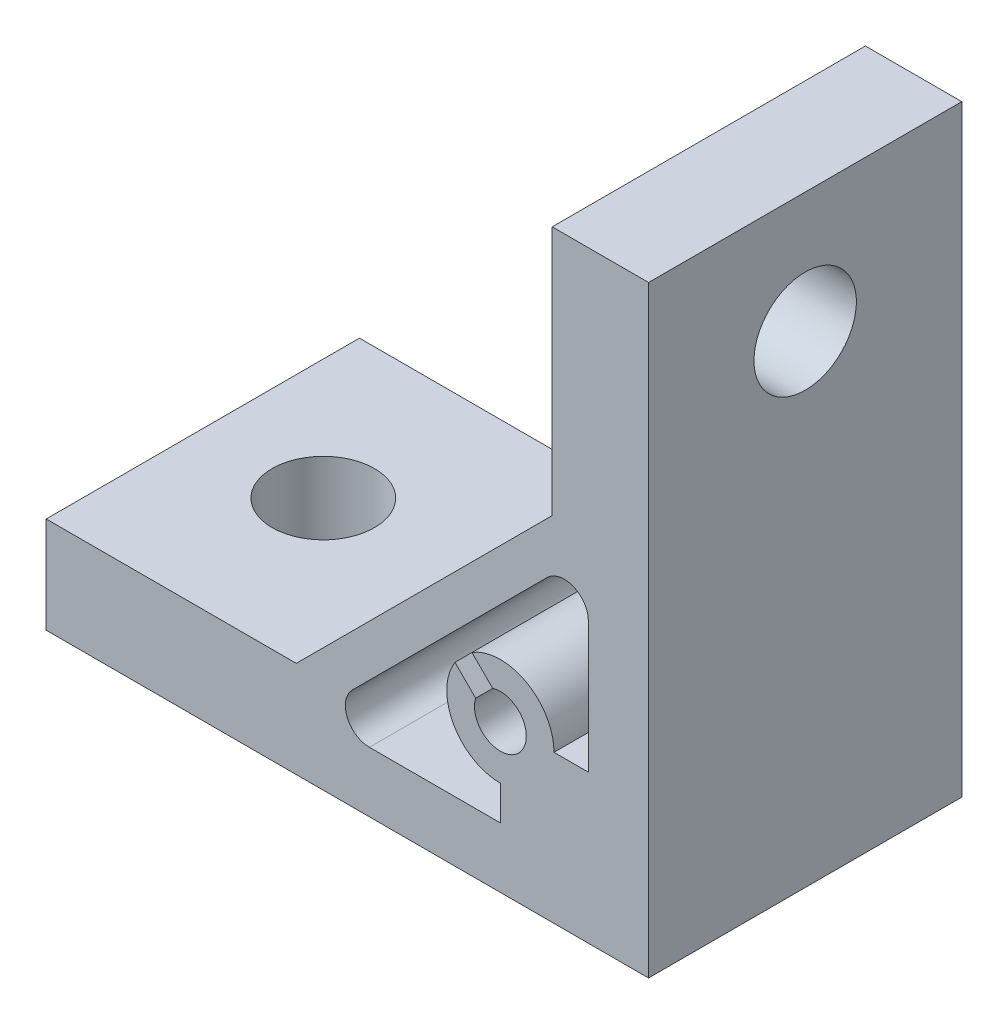
ISO-10303-21;
HEADER;
FILE_DESCRIPTION(('STEP AP214'),'2;1');
FILE_NAME('part.step','',(''),(''),'','','');
FILE_SCHEMA(('AUTOMOTIVE_DESIGN { 1 0 10303 214 1 1 1 1 }'));
ENDSEC;
DATA;
#1=APPLICATION_CONTEXT('core data for automotive mechanical design processes');
#2=APPLICATION_PROTOCOL_DEFINITION('international standard','automotive_design',2000,#1);
#3=PRODUCT_CONTEXT('',#1,'mechanical');
#4=PRODUCT('Part','Part','',(#3));
#5=PRODUCT_RELATED_PRODUCT_CATEGORY('part','',(#4));
#6=PRODUCT_DEFINITION_FORMATION('','',#4);
#7=PRODUCT_DEFINITION_CONTEXT('part definition',#1,'design');
#8=PRODUCT_DEFINITION('design','',#6,#7);
#9=PRODUCT_DEFINITION_SHAPE('','',#8);
#10=(LENGTH_UNIT() NAMED_UNIT(*) SI_UNIT(.MILLI.,.METRE.));
#11=(NAMED_UNIT(*) PLANE_ANGLE_UNIT() SI_UNIT($,.RADIAN.));
#12=(NAMED_UNIT(*) SI_UNIT($,.STERADIAN.) SOLID_ANGLE_UNIT());
#13=UNCERTAINTY_MEASURE_WITH_UNIT(LENGTH_MEASURE(1.E-05),#10,'distance_accuracy_value','');
#14=(GEOMETRIC_REPRESENTATION_CONTEXT(3) GLOBAL_UNCERTAINTY_ASSIGNED_CONTEXT((#13)) GLOBAL_UNIT_ASSIGNED_CONTEXT((#10,
#11,#12)) REPRESENTATION_CONTEXT('',''));
#15=CARTESIAN_POINT('',(0.,0.,0.));
#16=DIRECTION('',(0.,0.,1.));
#17=DIRECTION('',(1.,0.,0.));
#18=AXIS2_PLACEMENT_3D('',#15,#16,#17);
#19=CARTESIAN_POINT('',(50.,0.,13.));
#20=DIRECTION('',(-1.,0.,0.));
#21=DIRECTION('',(0.,0.,1.));
#22=AXIS2_PLACEMENT_3D('',#19,#20,#21);
#23=PLANE('',#22);
#24=DIRECTION('',(0.,1.,0.));
#25=VECTOR('',#24,1.);
#26=CARTESIAN_POINT('',(50.,0.,-13.));
#27=LINE('',#26,#25);
#28=CARTESIAN_POINT('',(50.,0.,-13.));
#29=VERTEX_POINT('',#28);
#30=CARTESIAN_POINT('',(50.,50.,-13.));
#31=VERTEX_POINT('',#30);
#32=EDGE_CURVE('E283',#29,#31,#27,.T.);
#33=ORIENTED_EDGE('',*,*,#32,.T.);
#34=DIRECTION('',(0.,0.,-1.));
#35=VECTOR('',#34,1.);
#36=CARTESIAN_POINT('',(50.,50.,13.));
#37=LINE('',#36,#35);
#38=CARTESIAN_POINT('',(50.,50.,13.));
#39=VERTEX_POINT('',#38);
#40=EDGE_CURVE('E303',#39,#31,#37,.T.);
#41=ORIENTED_EDGE('',*,*,#40,.F.);
#42=DIRECTION('',(0.,1.,0.));
#43=VECTOR('',#42,1.);
#44=CARTESIAN_POINT('',(50.,0.,13.));
#45=LINE('',#44,#43);
#46=CARTESIAN_POINT('',(50.,0.,13.));
#47=VERTEX_POINT('',#46);
#48=EDGE_CURVE('E268',#47,#39,#45,.T.);
#49=ORIENTED_EDGE('',*,*,#48,.F.);
#50=DIRECTION('',(0.,0.,-1.));
#51=VECTOR('',#50,1.);
#52=CARTESIAN_POINT('',(50.,0.,13.));
#53=LINE('',#52,#51);
#54=EDGE_CURVE('E43',#47,#29,#53,.T.);
#55=ORIENTED_EDGE('',*,*,#54,.T.);
#56=EDGE_LOOP('',(#33,#41,#49,#55));
#57=FACE_BOUND('',#56,.T.);
#58=CARTESIAN_POINT('',(50.0000000000001,40.,0.));
#59=DIRECTION('',(1.,0.,0.));
#60=DIRECTION('',(0.,0.,1.));
#61=AXIS2_PLACEMENT_3D('',#58,#59,#60);
#62=CIRCLE('',#61,4.25);
#63=CARTESIAN_POINT('',(50.0000000000001,40.,4.25));
#64=VERTEX_POINT('',#63);
#65=EDGE_CURVE('E369',#64,#64,#62,.T.);
#66=ORIENTED_EDGE('',*,*,#65,.F.);
#67=EDGE_LOOP('',(#66));
#68=FACE_BOUND('',#67,.T.);
#69=ADVANCED_FACE('F35',(#57,#68),#23,.F.);
#70=CARTESIAN_POINT('',(42.,29.2426406871192,13.));
#71=DIRECTION('',(1.,0.,0.));
#72=DIRECTION('',(0.,0.,-1.));
#73=AXIS2_PLACEMENT_3D('',#70,#71,#72);
#74=PLANE('',#73);
#75=DIRECTION('',(0.,-1.,0.));
#76=VECTOR('',#75,1.);
#77=CARTESIAN_POINT('',(42.,29.2426406871192,-13.));
#78=LINE('',#77,#76);
#79=CARTESIAN_POINT('',(42.,50.,-13.));
#80=VERTEX_POINT('',#79);
#81=CARTESIAN_POINT('',(42.,29.2426406871192,-13.));
#82=VERTEX_POINT('',#81);
#83=EDGE_CURVE('E287',#80,#82,#78,.T.);
#84=ORIENTED_EDGE('',*,*,#83,.T.);
#85=DIRECTION('',(0.,0.,-1.));
#86=VECTOR('',#85,1.);
#87=CARTESIAN_POINT('',(42.,29.2426406871192,13.));
#88=LINE('',#87,#86);
#89=CARTESIAN_POINT('',(42.,29.2426406871192,13.));
#90=VERTEX_POINT('',#89);
#91=EDGE_CURVE('E297',#90,#82,#88,.T.);
#92=ORIENTED_EDGE('',*,*,#91,.F.);
#93=DIRECTION('',(0.,-1.,0.));
#94=VECTOR('',#93,1.);
#95=CARTESIAN_POINT('',(42.,29.2426406871192,13.));
#96=LINE('',#95,#94);
#97=CARTESIAN_POINT('',(42.,50.,13.));
#98=VERTEX_POINT('',#97);
#99=EDGE_CURVE('E272',#98,#90,#96,.T.);
#100=ORIENTED_EDGE('',*,*,#99,.F.);
#101=DIRECTION('',(0.,0.,-1.));
#102=VECTOR('',#101,1.);
#103=CARTESIAN_POINT('',(42.,50.,13.));
#104=LINE('',#103,#102);
#105=EDGE_CURVE('E300',#98,#80,#104,.T.);
#106=ORIENTED_EDGE('',*,*,#105,.T.);
#107=EDGE_LOOP('',(#84,#92,#100,#106));
#108=FACE_BOUND('',#107,.T.);
#109=CARTESIAN_POINT('',(42.0000000000002,40.,0.));
#110=DIRECTION('',(1.,0.,0.));
#111=DIRECTION('',(0.,0.,1.));
#112=AXIS2_PLACEMENT_3D('',#109,#110,#111);
#113=CIRCLE('',#112,4.25);
#114=CARTESIAN_POINT('',(42.0000000000002,40.,4.25));
#115=VERTEX_POINT('',#114);
#116=EDGE_CURVE('E371',#115,#115,#113,.T.);
#117=ORIENTED_EDGE('',*,*,#116,.T.);
#118=EDGE_LOOP('',(#117));
#119=FACE_BOUND('',#118,.T.);
#120=ADVANCED_FACE('F326',(#108,#119),#74,.F.);
#121=CARTESIAN_POINT('',(0.,0.,13.));
#122=DIRECTION('',(0.,0.,1.));
#123=DIRECTION('',(1.,0.,0.));
#124=AXIS2_PLACEMENT_3D('',#121,#122,#123);
#125=PLANE('',#124);
#126=DIRECTION('',(0.,-1.,0.));
#127=VECTOR('',#126,1.);
#128=CARTESIAN_POINT('',(0.,8.,13.));
#129=LINE('',#128,#127);
#130=CARTESIAN_POINT('',(0.,8.,13.));
#131=VERTEX_POINT('',#130);
#132=CARTESIAN_POINT('',(0.,0.,13.));
#133=VERTEX_POINT('',#132);
#134=EDGE_CURVE('E262',#131,#133,#129,.T.);
#135=ORIENTED_EDGE('',*,*,#134,.T.);
#136=DIRECTION('',(1.,0.,0.));
#137=VECTOR('',#136,1.);
#138=CARTESIAN_POINT('',(0.,0.,13.));
#139=LINE('',#138,#137);
#140=EDGE_CURVE('E265',#133,#47,#139,.T.);
#141=ORIENTED_EDGE('',*,*,#140,.T.);
#142=ORIENTED_EDGE('',*,*,#48,.T.);
#143=DIRECTION('',(-1.,0.,0.));
#144=VECTOR('',#143,1.);
#145=CARTESIAN_POINT('',(42.,50.,13.));
#146=LINE('',#145,#144);
#147=EDGE_CURVE('E270',#39,#98,#146,.T.);
#148=ORIENTED_EDGE('',*,*,#147,.T.);
#149=ORIENTED_EDGE('',*,*,#99,.T.);
#150=DIRECTION('',(-0.707106781186546,-0.707106781186549,0.));
#151=VECTOR('',#150,1.);
#152=CARTESIAN_POINT('',(20.7573593128809,8.,13.));
#153=LINE('',#152,#151);
#154=CARTESIAN_POINT('',(20.7573593128809,8.,13.));
#155=VERTEX_POINT('',#154);
#156=EDGE_CURVE('E274',#90,#155,#153,.T.);
#157=ORIENTED_EDGE('',*,*,#156,.T.);
#158=DIRECTION('',(-1.,0.,0.));
#159=VECTOR('',#158,1.);
#160=CARTESIAN_POINT('',(0.,8.,13.));
#161=LINE('',#160,#159);
#162=EDGE_CURVE('E276',#155,#131,#161,.T.);
#163=ORIENTED_EDGE('',*,*,#162,.T.);
#164=EDGE_LOOP('',(#135,#141,#142,#148,#149,#157,#163));
#165=FACE_BOUND('',#164,.T.);
#166=DIRECTION('',(0.707106781186549,-0.707106781186546,0.));
#167=VECTOR('',#166,1.);
#168=CARTESIAN_POINT('',(35.647066335444,12.9387201021829,13.));
#169=LINE('',#168,#167);
#170=CARTESIAN_POINT('',(33.9267474297161,14.6590390079109,13.));
#171=VERTEX_POINT('',#170);
#172=CARTESIAN_POINT('',(35.647066335444,12.9387201021829,13.));
#173=VERTEX_POINT('',#172);
#174=EDGE_CURVE('E174',#171,#173,#169,.T.);
#175=ORIENTED_EDGE('',*,*,#174,.F.);
#176=CARTESIAN_POINT('',(37.7,12.3,13.));
#177=DIRECTION('',(0.,0.,-1.));
#178=DIRECTION('',(1.,0.,0.));
#179=AXIS2_PLACEMENT_3D('',#176,#177,#178);
#180=CIRCLE('',#179,4.45);
#181=CARTESIAN_POINT('',(37.7,7.84999999999995,13.));
#182=VERTEX_POINT('',#181);
#183=EDGE_CURVE('E166',#182,#171,#180,.T.);
#184=ORIENTED_EDGE('',*,*,#183,.F.);
#185=DIRECTION('',(0.,1.,0.));
#186=VECTOR('',#185,1.);
#187=CARTESIAN_POINT('',(37.7,5.,13.));
#188=LINE('',#187,#186);
#189=CARTESIAN_POINT('',(37.7,5.,13.));
#190=VERTEX_POINT('',#189);
#191=EDGE_CURVE('E209',#190,#182,#188,.T.);
#192=ORIENTED_EDGE('',*,*,#191,.F.);
#193=DIRECTION('',(1.,0.,0.));
#194=VECTOR('',#193,1.);
#195=CARTESIAN_POINT('',(26.828427124746,5.,13.));
#196=LINE('',#195,#194);
#197=CARTESIAN_POINT('',(26.828427124746,4.99999999999993,13.));
#198=VERTEX_POINT('',#197);
#199=EDGE_CURVE('E207',#198,#190,#196,.T.);
#200=ORIENTED_EDGE('',*,*,#199,.F.);
#201=CARTESIAN_POINT('',(26.8284271247464,7.00000000000011,13.));
#202=DIRECTION('',(0.,0.,1.));
#203=DIRECTION('',(1.,0.,0.));
#204=AXIS2_PLACEMENT_3D('',#201,#202,#203);
#205=CIRCLE('',#204,2.00000000000019);
#206=CARTESIAN_POINT('',(25.4142135623729,8.41421356237311,13.));
#207=VERTEX_POINT('',#206);
#208=EDGE_CURVE('E205',#207,#198,#205,.T.);
#209=ORIENTED_EDGE('',*,*,#208,.F.);
#210=DIRECTION('',(-0.70710678118655,-0.707106781186545,0.));
#211=VECTOR('',#210,1.);
#212=CARTESIAN_POINT('',(25.4142135623729,8.41421356237311,13.));
#213=LINE('',#212,#211);
#214=CARTESIAN_POINT('',(41.585786437627,24.5857864376269,13.));
#215=VERTEX_POINT('',#214);
#216=EDGE_CURVE('E203',#215,#207,#213,.T.);
#217=ORIENTED_EDGE('',*,*,#216,.F.);
#218=CARTESIAN_POINT('',(43.0000000000002,23.171572875254,13.));
#219=DIRECTION('',(0.,0.,1.));
#220=DIRECTION('',(1.,0.,0.));
#221=AXIS2_PLACEMENT_3D('',#218,#219,#220);
#222=CIRCLE('',#221,1.99999999999993);
#223=CARTESIAN_POINT('',(45.,23.1715728752539,13.));
#224=VERTEX_POINT('',#223);
#225=EDGE_CURVE('E201',#224,#215,#222,.T.);
#226=ORIENTED_EDGE('',*,*,#225,.F.);
#227=DIRECTION('',(0.,1.,0.));
#228=VECTOR('',#227,1.);
#229=CARTESIAN_POINT('',(45.,23.1715728752539,13.));
#230=LINE('',#229,#228);
#231=CARTESIAN_POINT('',(45.,12.3,13.));
#232=VERTEX_POINT('',#231);
#233=EDGE_CURVE('E199',#232,#224,#230,.T.);
#234=ORIENTED_EDGE('',*,*,#233,.F.);
#235=DIRECTION('',(1.,0.,0.));
#236=VECTOR('',#235,1.);
#237=CARTESIAN_POINT('',(42.15,12.3,13.));
#238=LINE('',#237,#236);
#239=CARTESIAN_POINT('',(42.15,12.3,13.));
#240=VERTEX_POINT('',#239);
#241=EDGE_CURVE('E197',#240,#232,#238,.T.);
#242=ORIENTED_EDGE('',*,*,#241,.F.);
#243=CARTESIAN_POINT('',(37.7,12.3,13.));
#244=DIRECTION('',(0.,0.,-1.));
#245=DIRECTION('',(1.,0.,0.));
#246=AXIS2_PLACEMENT_3D('',#243,#244,#245);
#247=CIRCLE('',#246,4.45);
#248=CARTESIAN_POINT('',(35.3409609920885,16.0732525702836,13.));
#249=VERTEX_POINT('',#248);
#250=EDGE_CURVE('E195',#249,#240,#247,.T.);
#251=ORIENTED_EDGE('',*,*,#250,.F.);
#252=DIRECTION('',(-0.707106781186684,0.707106781186411,0.));
#253=VECTOR('',#252,1.);
#254=CARTESIAN_POINT('',(37.0612798978168,14.3529336645559,13.));
#255=LINE('',#254,#253);
#256=CARTESIAN_POINT('',(37.0612798978168,14.3529336645559,13.));
#257=VERTEX_POINT('',#256);
#258=EDGE_CURVE('E190',#257,#249,#255,.T.);
#259=ORIENTED_EDGE('',*,*,#258,.F.);
#260=CARTESIAN_POINT('',(37.7,12.3,13.));
#261=DIRECTION('',(0.,0.,1.));
#262=DIRECTION('',(1.,0.,0.));
#263=AXIS2_PLACEMENT_3D('',#260,#261,#262);
#264=CIRCLE('',#263,2.15);
#265=EDGE_CURVE('E188',#173,#257,#264,.T.);
#266=ORIENTED_EDGE('',*,*,#265,.F.);
#267=EDGE_LOOP('',(#175,#184,#192,#200,#209,#217,#226,#234,#242,#251,#259,#266));
#268=FACE_BOUND('',#267,.T.);
#269=ADVANCED_FACE('F186',(#165,#268),#125,.T.);
#270=CARTESIAN_POINT('',(0.,0.,-13.));
#271=DIRECTION('',(0.,0.,1.));
#272=DIRECTION('',(1.,0.,0.));
#273=AXIS2_PLACEMENT_3D('',#270,#271,#272);
#274=PLANE('',#273);
#275=DIRECTION('',(0.,-1.,0.));
#276=VECTOR('',#275,1.);
#277=CARTESIAN_POINT('',(0.,8.,-13.));
#278=LINE('',#277,#276);
#279=CARTESIAN_POINT('',(0.,8.,-13.));
#280=VERTEX_POINT('',#279);
#281=CARTESIAN_POINT('',(0.,0.,-13.));
#282=VERTEX_POINT('',#281);
#283=EDGE_CURVE('E182',#280,#282,#278,.T.);
#284=ORIENTED_EDGE('',*,*,#283,.F.);
#285=DIRECTION('',(-1.,0.,0.));
#286=VECTOR('',#285,1.);
#287=CARTESIAN_POINT('',(0.,8.,-13.));
#288=LINE('',#287,#286);
#289=CARTESIAN_POINT('',(20.7573593128809,8.,-13.));
#290=VERTEX_POINT('',#289);
#291=EDGE_CURVE('E266',#290,#280,#288,.T.);
#292=ORIENTED_EDGE('',*,*,#291,.F.);
#293=DIRECTION('',(-0.707106781186546,-0.707106781186549,0.));
#294=VECTOR('',#293,1.);
#295=CARTESIAN_POINT('',(20.7573593128809,8.,-13.));
#296=LINE('',#295,#294);
#297=EDGE_CURVE('E289',#82,#290,#296,.T.);
#298=ORIENTED_EDGE('',*,*,#297,.F.);
#299=ORIENTED_EDGE('',*,*,#83,.F.);
#300=DIRECTION('',(-1.,0.,0.));
#301=VECTOR('',#300,1.);
#302=CARTESIAN_POINT('',(42.,50.,-13.));
#303=LINE('',#302,#301);
#304=EDGE_CURVE('E285',#31,#80,#303,.T.);
#305=ORIENTED_EDGE('',*,*,#304,.F.);
#306=ORIENTED_EDGE('',*,*,#32,.F.);
#307=DIRECTION('',(1.,0.,0.));
#308=VECTOR('',#307,1.);
#309=CARTESIAN_POINT('',(0.,0.,-13.));
#310=LINE('',#309,#308);
#311=EDGE_CURVE('E281',#282,#29,#310,.T.);
#312=ORIENTED_EDGE('',*,*,#311,.F.);
#313=EDGE_LOOP('',(#284,#292,#298,#299,#305,#306,#312));
#314=FACE_BOUND('',#313,.T.);
#315=CARTESIAN_POINT('',(37.7,12.3,-13.));
#316=DIRECTION('',(0.,0.,-1.));
#317=DIRECTION('',(1.,0.,0.));
#318=AXIS2_PLACEMENT_3D('',#315,#316,#317);
#319=CIRCLE('',#318,4.45);
#320=CARTESIAN_POINT('',(37.7,7.84999999999995,-13.));
#321=VERTEX_POINT('',#320);
#322=CARTESIAN_POINT('',(33.9267474297161,14.6590390079109,-13.));
#323=VERTEX_POINT('',#322);
#324=EDGE_CURVE('E58',#321,#323,#319,.T.);
#325=ORIENTED_EDGE('',*,*,#324,.T.);
#326=DIRECTION('',(0.707106781186549,-0.707106781186546,0.));
#327=VECTOR('',#326,1.);
#328=CARTESIAN_POINT('',(35.647066335444,12.9387201021829,-13.));
#329=LINE('',#328,#327);
#330=CARTESIAN_POINT('',(35.647066335444,12.9387201021829,-13.));
#331=VERTEX_POINT('',#330);
#332=EDGE_CURVE('E181',#323,#331,#329,.T.);
#333=ORIENTED_EDGE('',*,*,#332,.T.);
#334=CARTESIAN_POINT('',(37.7,12.3,-13.));
#335=DIRECTION('',(0.,0.,1.));
#336=DIRECTION('',(1.,0.,0.));
#337=AXIS2_PLACEMENT_3D('',#334,#335,#336);
#338=CIRCLE('',#337,2.15);
#339=CARTESIAN_POINT('',(37.0612798978168,14.3529336645559,-13.));
#340=VERTEX_POINT('',#339);
#341=EDGE_CURVE('E214',#331,#340,#338,.T.);
#342=ORIENTED_EDGE('',*,*,#341,.T.);
#343=DIRECTION('',(-0.707106781186684,0.707106781186411,0.));
#344=VECTOR('',#343,1.);
#345=CARTESIAN_POINT('',(37.0612798978168,14.3529336645559,-13.));
#346=LINE('',#345,#344);
#347=CARTESIAN_POINT('',(35.3409609920885,16.0732525702836,-13.));
#348=VERTEX_POINT('',#347);
#349=EDGE_CURVE('E217',#340,#348,#346,.T.);
#350=ORIENTED_EDGE('',*,*,#349,.T.);
#351=CARTESIAN_POINT('',(37.7,12.3,-13.));
#352=DIRECTION('',(0.,0.,-1.));
#353=DIRECTION('',(1.,0.,0.));
#354=AXIS2_PLACEMENT_3D('',#351,#352,#353);
#355=CIRCLE('',#354,4.45);
#356=CARTESIAN_POINT('',(42.15,12.3,-13.));
#357=VERTEX_POINT('',#356);
#358=EDGE_CURVE('E220',#348,#357,#355,.T.);
#359=ORIENTED_EDGE('',*,*,#358,.T.);
#360=DIRECTION('',(1.,0.,0.));
#361=VECTOR('',#360,1.);
#362=CARTESIAN_POINT('',(42.15,12.3,-13.));
#363=LINE('',#362,#361);
#364=CARTESIAN_POINT('',(45.,12.3,-13.));
#365=VERTEX_POINT('',#364);
#366=EDGE_CURVE('E223',#357,#365,#363,.T.);
#367=ORIENTED_EDGE('',*,*,#366,.T.);
#368=DIRECTION('',(0.,1.,0.));
#369=VECTOR('',#368,1.);
#370=CARTESIAN_POINT('',(45.,23.1715728752539,-13.));
#371=LINE('',#370,#369);
#372=CARTESIAN_POINT('',(45.,23.1715728752539,-13.));
#373=VERTEX_POINT('',#372);
#374=EDGE_CURVE('E226',#365,#373,#371,.T.);
#375=ORIENTED_EDGE('',*,*,#374,.T.);
#376=CARTESIAN_POINT('',(43.0000000000002,23.171572875254,-13.));
#377=DIRECTION('',(0.,0.,1.));
#378=DIRECTION('',(1.,0.,0.));
#379=AXIS2_PLACEMENT_3D('',#376,#377,#378);
#380=CIRCLE('',#379,1.99999999999993);
#381=CARTESIAN_POINT('',(41.585786437627,24.5857864376269,-13.));
#382=VERTEX_POINT('',#381);
#383=EDGE_CURVE('E229',#373,#382,#380,.T.);
#384=ORIENTED_EDGE('',*,*,#383,.T.);
#385=DIRECTION('',(-0.70710678118655,-0.707106781186545,0.));
#386=VECTOR('',#385,1.);
#387=CARTESIAN_POINT('',(25.4142135623729,8.41421356237311,-13.));
#388=LINE('',#387,#386);
#389=CARTESIAN_POINT('',(25.4142135623729,8.41421356237311,-13.));
#390=VERTEX_POINT('',#389);
#391=EDGE_CURVE('E232',#382,#390,#388,.T.);
#392=ORIENTED_EDGE('',*,*,#391,.T.);
#393=CARTESIAN_POINT('',(26.8284271247464,7.00000000000011,-13.));
#394=DIRECTION('',(0.,0.,1.));
#395=DIRECTION('',(1.,0.,0.));
#396=AXIS2_PLACEMENT_3D('',#393,#394,#395);
#397=CIRCLE('',#396,2.00000000000019);
#398=CARTESIAN_POINT('',(26.828427124746,4.99999999999993,-13.));
#399=VERTEX_POINT('',#398);
#400=EDGE_CURVE('E235',#390,#399,#397,.T.);
#401=ORIENTED_EDGE('',*,*,#400,.T.);
#402=DIRECTION('',(1.,0.,0.));
#403=VECTOR('',#402,1.);
#404=CARTESIAN_POINT('',(26.828427124746,5.,-13.));
#405=LINE('',#404,#403);
#406=CARTESIAN_POINT('',(37.7,5.,-13.));
#407=VERTEX_POINT('',#406);
#408=EDGE_CURVE('E238',#399,#407,#405,.T.);
#409=ORIENTED_EDGE('',*,*,#408,.T.);
#410=DIRECTION('',(0.,1.,0.));
#411=VECTOR('',#410,1.);
#412=CARTESIAN_POINT('',(37.7,5.,-13.));
#413=LINE('',#412,#411);
#414=EDGE_CURVE('E175',#407,#321,#413,.T.);
#415=ORIENTED_EDGE('',*,*,#414,.T.);
#416=EDGE_LOOP('',(#325,#333,#342,#350,#359,#367,#375,#384,#392,#401,#409,#415));
#417=FACE_BOUND('',#416,.T.);
#418=ADVANCED_FACE('F316',(#314,#417),#274,.F.);
#419=CARTESIAN_POINT('',(0.,8.,13.));
#420=DIRECTION('',(1.,0.,0.));
#421=DIRECTION('',(0.,0.,-1.));
#422=AXIS2_PLACEMENT_3D('',#419,#420,#421);
#423=PLANE('',#422);
#424=ORIENTED_EDGE('',*,*,#283,.T.);
#425=DIRECTION('',(0.,0.,-1.));
#426=VECTOR('',#425,1.);
#427=CARTESIAN_POINT('',(0.,0.,13.));
#428=LINE('',#427,#426);
#429=EDGE_CURVE('E11',#133,#282,#428,.T.);
#430=ORIENTED_EDGE('',*,*,#429,.F.);
#431=ORIENTED_EDGE('',*,*,#134,.F.);
#432=DIRECTION('',(0.,0.,-1.));
#433=VECTOR('',#432,1.);
#434=CARTESIAN_POINT('',(0.,8.,13.));
#435=LINE('',#434,#433);
#436=EDGE_CURVE('E278',#131,#280,#435,.T.);
#437=ORIENTED_EDGE('',*,*,#436,.T.);
#438=EDGE_LOOP('',(#424,#430,#431,#437));
#439=FACE_BOUND('',#438,.T.);
#440=ADVANCED_FACE('F37',(#439),#423,.F.);
#441=CARTESIAN_POINT('',(0.,0.,13.));
#442=DIRECTION('',(0.,1.,0.));
#443=DIRECTION('',(0.,0.,1.));
#444=AXIS2_PLACEMENT_3D('',#441,#442,#443);
#445=PLANE('',#444);
#446=CARTESIAN_POINT('',(10.,0.,0.));
#447=DIRECTION('',(0.,1.,0.));
#448=DIRECTION('',(0.,0.,1.));
#449=AXIS2_PLACEMENT_3D('',#446,#447,#448);
#450=CIRCLE('',#449,4.25);
#451=CARTESIAN_POINT('',(10.,0.,4.25));
#452=VERTEX_POINT('',#451);
#453=EDGE_CURVE('E212',#452,#452,#450,.T.);
#454=ORIENTED_EDGE('',*,*,#453,.T.);
#455=EDGE_LOOP('',(#454));
#456=FACE_BOUND('',#455,.T.);
#457=ORIENTED_EDGE('',*,*,#311,.T.);
#458=ORIENTED_EDGE('',*,*,#54,.F.);
#459=ORIENTED_EDGE('',*,*,#140,.F.);
#460=ORIENTED_EDGE('',*,*,#429,.T.);
#461=EDGE_LOOP('',(#457,#458,#459,#460));
#462=FACE_BOUND('',#461,.T.);
#463=ADVANCED_FACE('F334',(#456,#462),#445,.F.);
#464=CARTESIAN_POINT('',(42.,50.,13.));
#465=DIRECTION('',(0.,-1.,0.));
#466=DIRECTION('',(0.,0.,-1.));
#467=AXIS2_PLACEMENT_3D('',#464,#465,#466);
#468=PLANE('',#467);
#469=ORIENTED_EDGE('',*,*,#304,.T.);
#470=ORIENTED_EDGE('',*,*,#105,.F.);
#471=ORIENTED_EDGE('',*,*,#147,.F.);
#472=ORIENTED_EDGE('',*,*,#40,.T.);
#473=EDGE_LOOP('',(#469,#470,#471,#472));
#474=FACE_BOUND('',#473,.T.);
#475=ADVANCED_FACE('F322',(#474),#468,.F.);
#476=CARTESIAN_POINT('',(20.7573593128809,8.,13.));
#477=DIRECTION('',(0.707106781186549,-0.707106781186546,0.));
#478=DIRECTION('',(0.707106781186546,0.707106781186549,0.));
#479=AXIS2_PLACEMENT_3D('',#476,#477,#478);
#480=PLANE('',#479);
#481=ORIENTED_EDGE('',*,*,#297,.T.);
#482=DIRECTION('',(0.,0.,-1.));
#483=VECTOR('',#482,1.);
#484=CARTESIAN_POINT('',(20.7573593128809,8.,13.));
#485=LINE('',#484,#483);
#486=EDGE_CURVE('E294',#155,#290,#485,.T.);
#487=ORIENTED_EDGE('',*,*,#486,.F.);
#488=ORIENTED_EDGE('',*,*,#156,.F.);
#489=ORIENTED_EDGE('',*,*,#91,.T.);
#490=EDGE_LOOP('',(#481,#487,#488,#489));
#491=FACE_BOUND('',#490,.T.);
#492=ADVANCED_FACE('F342',(#491),#480,.F.);
#493=CARTESIAN_POINT('',(0.,8.,13.));
#494=DIRECTION('',(0.,-1.,0.));
#495=DIRECTION('',(0.,0.,-1.));
#496=AXIS2_PLACEMENT_3D('',#493,#494,#495);
#497=PLANE('',#496);
#498=CARTESIAN_POINT('',(10.,8.,0.));
#499=DIRECTION('',(0.,1.,0.));
#500=DIRECTION('',(0.,0.,1.));
#501=AXIS2_PLACEMENT_3D('',#498,#499,#500);
#502=CIRCLE('',#501,4.25);
#503=CARTESIAN_POINT('',(10.,8.,4.25));
#504=VERTEX_POINT('',#503);
#505=EDGE_CURVE('E366',#504,#504,#502,.T.);
#506=ORIENTED_EDGE('',*,*,#505,.F.);
#507=EDGE_LOOP('',(#506));
#508=FACE_BOUND('',#507,.T.);
#509=ORIENTED_EDGE('',*,*,#291,.T.);
#510=ORIENTED_EDGE('',*,*,#436,.F.);
#511=ORIENTED_EDGE('',*,*,#162,.F.);
#512=ORIENTED_EDGE('',*,*,#486,.T.);
#513=EDGE_LOOP('',(#509,#510,#511,#512));
#514=FACE_BOUND('',#513,.T.);
#515=ADVANCED_FACE('F339',(#508,#514),#497,.F.);
#516=CARTESIAN_POINT('',(37.7,12.3,13.));
#517=DIRECTION('',(0.,0.,-1.));
#518=DIRECTION('',(-1.,0.,0.));
#519=AXIS2_PLACEMENT_3D('',#516,#517,#518);
#520=CYLINDRICAL_SURFACE('',#519,4.45);
#521=ORIENTED_EDGE('',*,*,#324,.F.);
#522=DIRECTION('',(0.,0.,-1.));
#523=VECTOR('',#522,1.);
#524=CARTESIAN_POINT('',(37.7,7.84999999999995,13.));
#525=LINE('',#524,#523);
#526=EDGE_CURVE('E170',#182,#321,#525,.T.);
#527=ORIENTED_EDGE('',*,*,#526,.F.);
#528=ORIENTED_EDGE('',*,*,#183,.T.);
#529=DIRECTION('',(0.,0.,-1.));
#530=VECTOR('',#529,1.);
#531=CARTESIAN_POINT('',(33.9267474297161,14.6590390079109,13.));
#532=LINE('',#531,#530);
#533=EDGE_CURVE('E169',#171,#323,#532,.T.);
#534=ORIENTED_EDGE('',*,*,#533,.T.);
#535=EDGE_LOOP('',(#521,#527,#528,#534));
#536=FACE_BOUND('',#535,.T.);
#537=ADVANCED_FACE('F168',(#536),#520,.T.);
#538=CARTESIAN_POINT('',(35.647066335444,12.9387201021829,13.));
#539=DIRECTION('',(0.707106781186546,0.707106781186549,0.));
#540=DIRECTION('',(-0.707106781186549,0.707106781186546,0.));
#541=AXIS2_PLACEMENT_3D('',#538,#539,#540);
#542=PLANE('',#541);
#543=ORIENTED_EDGE('',*,*,#332,.F.);
#544=ORIENTED_EDGE('',*,*,#533,.F.);
#545=ORIENTED_EDGE('',*,*,#174,.T.);
#546=DIRECTION('',(0.,0.,-1.));
#547=VECTOR('',#546,1.);
#548=CARTESIAN_POINT('',(35.647066335444,12.9387201021829,13.));
#549=LINE('',#548,#547);
#550=EDGE_CURVE('E183',#173,#331,#549,.T.);
#551=ORIENTED_EDGE('',*,*,#550,.T.);
#552=EDGE_LOOP('',(#543,#544,#545,#551));
#553=FACE_BOUND('',#552,.T.);
#554=ADVANCED_FACE('F178',(#553),#542,.T.);
#555=CARTESIAN_POINT('',(37.7,12.3,13.));
#556=DIRECTION('',(0.,0.,-1.));
#557=DIRECTION('',(-1.,0.,0.));
#558=AXIS2_PLACEMENT_3D('',#555,#556,#557);
#559=CYLINDRICAL_SURFACE('',#558,2.15);
#560=ORIENTED_EDGE('',*,*,#341,.F.);
#561=ORIENTED_EDGE('',*,*,#550,.F.);
#562=ORIENTED_EDGE('',*,*,#265,.T.);
#563=DIRECTION('',(0.,0.,-1.));
#564=VECTOR('',#563,1.);
#565=CARTESIAN_POINT('',(37.0612798978168,14.3529336645559,13.));
#566=LINE('',#565,#564);
#567=EDGE_CURVE('E259',#257,#340,#566,.T.);
#568=ORIENTED_EDGE('',*,*,#567,.T.);
#569=EDGE_LOOP('',(#560,#561,#562,#568));
#570=FACE_BOUND('',#569,.T.);
#571=ADVANCED_FACE('F422',(#570),#559,.F.);
#572=CARTESIAN_POINT('',(37.0612798978168,14.3529336645559,13.));
#573=DIRECTION('',(-0.707106781186411,-0.707106781186684,0.));
#574=DIRECTION('',(0.707106781186684,-0.707106781186411,0.));
#575=AXIS2_PLACEMENT_3D('',#572,#573,#574);
#576=PLANE('',#575);
#577=ORIENTED_EDGE('',*,*,#349,.F.);
#578=ORIENTED_EDGE('',*,*,#567,.F.);
#579=ORIENTED_EDGE('',*,*,#258,.T.);
#580=DIRECTION('',(0.,0.,-1.));
#581=VECTOR('',#580,1.);
#582=CARTESIAN_POINT('',(35.3409609920885,16.0732525702836,13.));
#583=LINE('',#582,#581);
#584=EDGE_CURVE('E257',#249,#348,#583,.T.);
#585=ORIENTED_EDGE('',*,*,#584,.T.);
#586=EDGE_LOOP('',(#577,#578,#579,#585));
#587=FACE_BOUND('',#586,.T.);
#588=ADVANCED_FACE('F418',(#587),#576,.T.);
#589=CARTESIAN_POINT('',(37.7,12.3,13.));
#590=DIRECTION('',(0.,0.,-1.));
#591=DIRECTION('',(-1.,0.,0.));
#592=AXIS2_PLACEMENT_3D('',#589,#590,#591);
#593=CYLINDRICAL_SURFACE('',#592,4.45);
#594=ORIENTED_EDGE('',*,*,#358,.F.);
#595=ORIENTED_EDGE('',*,*,#584,.F.);
#596=ORIENTED_EDGE('',*,*,#250,.T.);
#597=DIRECTION('',(0.,0.,-1.));
#598=VECTOR('',#597,1.);
#599=CARTESIAN_POINT('',(42.15,12.3,13.));
#600=LINE('',#599,#598);
#601=EDGE_CURVE('E255',#240,#357,#600,.T.);
#602=ORIENTED_EDGE('',*,*,#601,.T.);
#603=EDGE_LOOP('',(#594,#595,#596,#602));
#604=FACE_BOUND('',#603,.T.);
#605=ADVANCED_FACE('F414',(#604),#593,.T.);
#606=CARTESIAN_POINT('',(42.15,12.3,13.));
#607=DIRECTION('',(0.,1.,0.));
#608=DIRECTION('',(0.,0.,1.));
#609=AXIS2_PLACEMENT_3D('',#606,#607,#608);
#610=PLANE('',#609);
#611=ORIENTED_EDGE('',*,*,#366,.F.);
#612=ORIENTED_EDGE('',*,*,#601,.F.);
#613=ORIENTED_EDGE('',*,*,#241,.T.);
#614=DIRECTION('',(0.,0.,-1.));
#615=VECTOR('',#614,1.);
#616=CARTESIAN_POINT('',(45.,12.3,13.));
#617=LINE('',#616,#615);
#618=EDGE_CURVE('E253',#232,#365,#617,.T.);
#619=ORIENTED_EDGE('',*,*,#618,.T.);
#620=EDGE_LOOP('',(#611,#612,#613,#619));
#621=FACE_BOUND('',#620,.T.);
#622=ADVANCED_FACE('F410',(#621),#610,.T.);
#623=CARTESIAN_POINT('',(45.,23.1715728752539,13.));
#624=DIRECTION('',(-1.,0.,0.));
#625=DIRECTION('',(0.,0.,1.));
#626=AXIS2_PLACEMENT_3D('',#623,#624,#625);
#627=PLANE('',#626);
#628=ORIENTED_EDGE('',*,*,#374,.F.);
#629=ORIENTED_EDGE('',*,*,#618,.F.);
#630=ORIENTED_EDGE('',*,*,#233,.T.);
#631=DIRECTION('',(0.,0.,-1.));
#632=VECTOR('',#631,1.);
#633=CARTESIAN_POINT('',(45.,23.1715728752539,13.));
#634=LINE('',#633,#632);
#635=EDGE_CURVE('E251',#224,#373,#634,.T.);
#636=ORIENTED_EDGE('',*,*,#635,.T.);
#637=EDGE_LOOP('',(#628,#629,#630,#636));
#638=FACE_BOUND('',#637,.T.);
#639=ADVANCED_FACE('F406',(#638),#627,.T.);
#640=CARTESIAN_POINT('',(43.0000000000002,23.171572875254,13.));
#641=DIRECTION('',(0.,0.,-1.));
#642=DIRECTION('',(-1.,0.,0.));
#643=AXIS2_PLACEMENT_3D('',#640,#641,#642);
#644=CYLINDRICAL_SURFACE('',#643,1.99999999999993);
#645=ORIENTED_EDGE('',*,*,#383,.F.);
#646=ORIENTED_EDGE('',*,*,#635,.F.);
#647=ORIENTED_EDGE('',*,*,#225,.T.);
#648=DIRECTION('',(0.,0.,-1.));
#649=VECTOR('',#648,1.);
#650=CARTESIAN_POINT('',(41.585786437627,24.5857864376269,13.));
#651=LINE('',#650,#649);
#652=EDGE_CURVE('E249',#215,#382,#651,.T.);
#653=ORIENTED_EDGE('',*,*,#652,.T.);
#654=EDGE_LOOP('',(#645,#646,#647,#653));
#655=FACE_BOUND('',#654,.T.);
#656=ADVANCED_FACE('F402',(#655),#644,.F.);
#657=CARTESIAN_POINT('',(25.4142135623729,8.41421356237311,13.));
#658=DIRECTION('',(0.707106781186545,-0.70710678118655,0.));
#659=DIRECTION('',(0.70710678118655,0.707106781186545,0.));
#660=AXIS2_PLACEMENT_3D('',#657,#658,#659);
#661=PLANE('',#660);
#662=ORIENTED_EDGE('',*,*,#391,.F.);
#663=ORIENTED_EDGE('',*,*,#652,.F.);
#664=ORIENTED_EDGE('',*,*,#216,.T.);
#665=DIRECTION('',(0.,0.,-1.));
#666=VECTOR('',#665,1.);
#667=CARTESIAN_POINT('',(25.4142135623729,8.41421356237311,13.));
#668=LINE('',#667,#666);
#669=EDGE_CURVE('E247',#207,#390,#668,.T.);
#670=ORIENTED_EDGE('',*,*,#669,.T.);
#671=EDGE_LOOP('',(#662,#663,#664,#670));
#672=FACE_BOUND('',#671,.T.);
#673=ADVANCED_FACE('F398',(#672),#661,.T.);
#674=CARTESIAN_POINT('',(26.8284271247464,7.00000000000011,13.));
#675=DIRECTION('',(0.,0.,-1.));
#676=DIRECTION('',(-1.,0.,0.));
#677=AXIS2_PLACEMENT_3D('',#674,#675,#676);
#678=CYLINDRICAL_SURFACE('',#677,2.00000000000019);
#679=ORIENTED_EDGE('',*,*,#400,.F.);
#680=ORIENTED_EDGE('',*,*,#669,.F.);
#681=ORIENTED_EDGE('',*,*,#208,.T.);
#682=DIRECTION('',(0.,0.,-1.));
#683=VECTOR('',#682,1.);
#684=CARTESIAN_POINT('',(26.828427124746,4.99999999999993,13.));
#685=LINE('',#684,#683);
#686=EDGE_CURVE('E245',#198,#399,#685,.T.);
#687=ORIENTED_EDGE('',*,*,#686,.T.);
#688=EDGE_LOOP('',(#679,#680,#681,#687));
#689=FACE_BOUND('',#688,.T.);
#690=ADVANCED_FACE('F394',(#689),#678,.F.);
#691=CARTESIAN_POINT('',(26.828427124746,5.,13.));
#692=DIRECTION('',(0.,1.,0.));
#693=DIRECTION('',(0.,0.,1.));
#694=AXIS2_PLACEMENT_3D('',#691,#692,#693);
#695=PLANE('',#694);
#696=ORIENTED_EDGE('',*,*,#408,.F.);
#697=ORIENTED_EDGE('',*,*,#686,.F.);
#698=ORIENTED_EDGE('',*,*,#199,.T.);
#699=DIRECTION('',(0.,0.,-1.));
#700=VECTOR('',#699,1.);
#701=CARTESIAN_POINT('',(37.7,5.,13.));
#702=LINE('',#701,#700);
#703=EDGE_CURVE('E50',#190,#407,#702,.T.);
#704=ORIENTED_EDGE('',*,*,#703,.T.);
#705=EDGE_LOOP('',(#696,#697,#698,#704));
#706=FACE_BOUND('',#705,.T.);
#707=ADVANCED_FACE('F391',(#706),#695,.T.);
#708=CARTESIAN_POINT('',(37.7,5.,13.));
#709=DIRECTION('',(-1.,0.,0.));
#710=DIRECTION('',(0.,0.,1.));
#711=AXIS2_PLACEMENT_3D('',#708,#709,#710);
#712=PLANE('',#711);
#713=ORIENTED_EDGE('',*,*,#414,.F.);
#714=ORIENTED_EDGE('',*,*,#703,.F.);
#715=ORIENTED_EDGE('',*,*,#191,.T.);
#716=ORIENTED_EDGE('',*,*,#526,.T.);
#717=EDGE_LOOP('',(#713,#714,#715,#716));
#718=FACE_BOUND('',#717,.T.);
#719=ADVANCED_FACE('F386',(#718),#712,.T.);
#720=CARTESIAN_POINT('',(10.,0.,0.));
#721=DIRECTION('',(0.,1.,0.));
#722=DIRECTION('',(0.,0.,1.));
#723=AXIS2_PLACEMENT_3D('',#720,#721,#722);
#724=CYLINDRICAL_SURFACE('',#723,4.25);
#725=ORIENTED_EDGE('',*,*,#453,.F.);
#726=EDGE_LOOP('',(#725));
#727=FACE_BOUND('',#726,.T.);
#728=ORIENTED_EDGE('',*,*,#505,.T.);
#729=EDGE_LOOP('',(#728));
#730=FACE_BOUND('',#729,.T.);
#731=ADVANCED_FACE('F380',(#727,#730),#724,.F.);
#732=CARTESIAN_POINT('',(50.0000000000001,40.,0.));
#733=DIRECTION('',(-1.,0.,0.));
#734=DIRECTION('',(0.,-1.,0.));
#735=AXIS2_PLACEMENT_3D('',#732,#733,#734);
#736=CYLINDRICAL_SURFACE('',#735,4.25);
#737=ORIENTED_EDGE('',*,*,#65,.T.);
#738=EDGE_LOOP('',(#737));
#739=FACE_BOUND('',#738,.T.);
#740=ORIENTED_EDGE('',*,*,#116,.F.);
#741=EDGE_LOOP('',(#740));
#742=FACE_BOUND('',#741,.T.);
#743=ADVANCED_FACE('F377',(#739,#742),#736,.F.);
#744=CLOSED_SHELL('',(#69,#120,#269,#418,#440,#463,#475,#492,#515,#537,#554,#571,#588,#605,#622,
#639,#656,#673,#690,#707,#719,#731,#743));
#745=MANIFOLD_SOLID_BREP('B2',#744);
#746=ADVANCED_BREP_SHAPE_REPRESENTATION('',(#18,#745),#14);
#747=SHAPE_DEFINITION_REPRESENTATION(#9,#746);
ENDSEC;
END-ISO-10303-21;
